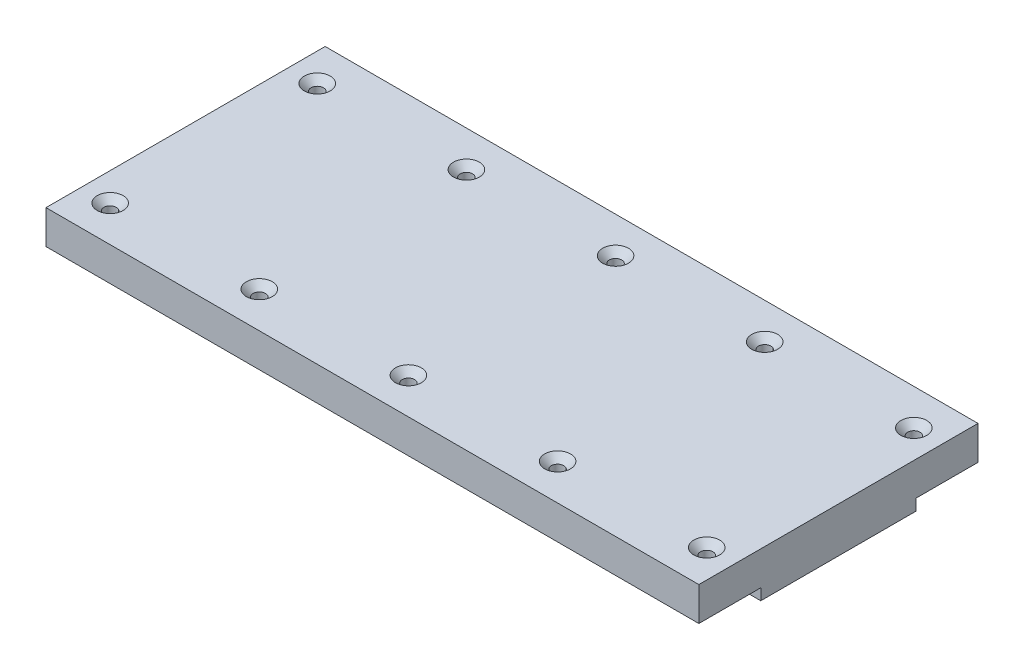
ISO-10303-21;
HEADER;
FILE_DESCRIPTION(('STEP AP214'),'2;1');
FILE_NAME('part.step','',(''),(''),'','','');
FILE_SCHEMA(('AUTOMOTIVE_DESIGN { 1 0 10303 214 1 1 1 1 }'));
ENDSEC;
DATA;
#1=APPLICATION_CONTEXT('core data for automotive mechanical design processes');
#2=APPLICATION_PROTOCOL_DEFINITION('international standard','automotive_design',2000,#1);
#3=PRODUCT_CONTEXT('',#1,'mechanical');
#4=PRODUCT('Part','Part','',(#3));
#5=PRODUCT_RELATED_PRODUCT_CATEGORY('part','',(#4));
#6=PRODUCT_DEFINITION_FORMATION('','',#4);
#7=PRODUCT_DEFINITION_CONTEXT('part definition',#1,'design');
#8=PRODUCT_DEFINITION('design','',#6,#7);
#9=PRODUCT_DEFINITION_SHAPE('','',#8);
#10=(LENGTH_UNIT() NAMED_UNIT(*) SI_UNIT(.MILLI.,.METRE.));
#11=(NAMED_UNIT(*) PLANE_ANGLE_UNIT() SI_UNIT($,.RADIAN.));
#12=(NAMED_UNIT(*) SI_UNIT($,.STERADIAN.) SOLID_ANGLE_UNIT());
#13=UNCERTAINTY_MEASURE_WITH_UNIT(LENGTH_MEASURE(1.E-05),#10,'distance_accuracy_value','');
#14=(GEOMETRIC_REPRESENTATION_CONTEXT(3) GLOBAL_UNCERTAINTY_ASSIGNED_CONTEXT((#13)) GLOBAL_UNIT_ASSIGNED_CONTEXT((#10,
#11,#12)) REPRESENTATION_CONTEXT('',''));
#15=CARTESIAN_POINT('',(0.,0.,0.));
#16=DIRECTION('',(0.,0.,1.));
#17=DIRECTION('',(1.,0.,0.));
#18=AXIS2_PLACEMENT_3D('',#15,#16,#17);
#19=CARTESIAN_POINT('',(290.,10.,69.));
#20=DIRECTION('',(-1.,0.,0.));
#21=DIRECTION('',(0.,0.,1.));
#22=AXIS2_PLACEMENT_3D('',#19,#20,#21);
#23=PLANE('',#22);
#24=DIRECTION('',(0.,0.,-1.));
#25=VECTOR('',#24,1.);
#26=CARTESIAN_POINT('',(290.,0.,69.));
#27=LINE('',#26,#25);
#28=CARTESIAN_POINT('',(290.,0.,69.));
#29=VERTEX_POINT('',#28);
#30=CARTESIAN_POINT('',(290.,0.,-69.));
#31=VERTEX_POINT('',#30);
#32=EDGE_CURVE('E135',#29,#31,#27,.T.);
#33=ORIENTED_EDGE('',*,*,#32,.T.);
#34=DIRECTION('',(0.,-1.,0.));
#35=VECTOR('',#34,1.);
#36=CARTESIAN_POINT('',(290.,10.,-69.));
#37=LINE('',#36,#35);
#38=CARTESIAN_POINT('',(290.,10.,-69.));
#39=VERTEX_POINT('',#38);
#40=EDGE_CURVE('E11',#39,#31,#37,.T.);
#41=ORIENTED_EDGE('',*,*,#40,.F.);
#42=DIRECTION('',(0.,0.,-1.));
#43=VECTOR('',#42,1.);
#44=CARTESIAN_POINT('',(290.,10.,-124.));
#45=LINE('',#44,#43);
#46=CARTESIAN_POINT('',(290.,10.,-124.));
#47=VERTEX_POINT('',#46);
#48=EDGE_CURVE('E133',#39,#47,#45,.T.);
#49=ORIENTED_EDGE('',*,*,#48,.T.);
#50=DIRECTION('',(0.,-1.,0.));
#51=VECTOR('',#50,1.);
#52=CARTESIAN_POINT('',(290.,40.,-124.));
#53=LINE('',#52,#51);
#54=CARTESIAN_POINT('',(290.,40.,-124.));
#55=VERTEX_POINT('',#54);
#56=EDGE_CURVE('E114',#55,#47,#53,.T.);
#57=ORIENTED_EDGE('',*,*,#56,.F.);
#58=DIRECTION('',(0.,0.,-1.));
#59=VECTOR('',#58,1.);
#60=CARTESIAN_POINT('',(290.,40.,-124.));
#61=LINE('',#60,#59);
#62=CARTESIAN_POINT('',(290.,40.,124.));
#63=VERTEX_POINT('',#62);
#64=EDGE_CURVE('E120',#63,#55,#61,.T.);
#65=ORIENTED_EDGE('',*,*,#64,.F.);
#66=DIRECTION('',(0.,-1.,0.));
#67=VECTOR('',#66,1.);
#68=CARTESIAN_POINT('',(290.,40.,124.));
#69=LINE('',#68,#67);
#70=CARTESIAN_POINT('',(290.,10.,124.));
#71=VERTEX_POINT('',#70);
#72=EDGE_CURVE('E241',#63,#71,#69,.T.);
#73=ORIENTED_EDGE('',*,*,#72,.T.);
#74=CARTESIAN_POINT('',(290.,10.,69.));
#75=VERTEX_POINT('',#74);
#76=EDGE_CURVE('E242',#71,#75,#45,.T.);
#77=ORIENTED_EDGE('',*,*,#76,.T.);
#78=DIRECTION('',(0.,-1.,0.));
#79=VECTOR('',#78,1.);
#80=CARTESIAN_POINT('',(290.,10.,69.));
#81=LINE('',#80,#79);
#82=EDGE_CURVE('E146',#75,#29,#81,.T.);
#83=ORIENTED_EDGE('',*,*,#82,.T.);
#84=EDGE_LOOP('',(#33,#41,#49,#57,#65,#73,#77,#83));
#85=FACE_BOUND('',#84,.T.);
#86=ADVANCED_FACE('F37',(#85),#23,.F.);
#87=CARTESIAN_POINT('',(-290.,10.,-69.));
#88=DIRECTION('',(0.,0.,1.));
#89=DIRECTION('',(1.,0.,0.));
#90=AXIS2_PLACEMENT_3D('',#87,#88,#89);
#91=PLANE('',#90);
#92=DIRECTION('',(-1.,0.,0.));
#93=VECTOR('',#92,1.);
#94=CARTESIAN_POINT('',(-290.,0.,-69.));
#95=LINE('',#94,#93);
#96=CARTESIAN_POINT('',(-290.,0.,-69.));
#97=VERTEX_POINT('',#96);
#98=EDGE_CURVE('E137',#31,#97,#95,.T.);
#99=ORIENTED_EDGE('',*,*,#98,.T.);
#100=DIRECTION('',(0.,-1.,0.));
#101=VECTOR('',#100,1.);
#102=CARTESIAN_POINT('',(-290.,10.,-69.));
#103=LINE('',#102,#101);
#104=CARTESIAN_POINT('',(-290.,10.,-69.));
#105=VERTEX_POINT('',#104);
#106=EDGE_CURVE('E46',#105,#97,#103,.T.);
#107=ORIENTED_EDGE('',*,*,#106,.F.);
#108=DIRECTION('',(-1.,0.,0.));
#109=VECTOR('',#108,1.);
#110=CARTESIAN_POINT('',(-290.,10.,-69.));
#111=LINE('',#110,#109);
#112=EDGE_CURVE('E81',#39,#105,#111,.T.);
#113=ORIENTED_EDGE('',*,*,#112,.F.);
#114=ORIENTED_EDGE('',*,*,#40,.T.);
#115=EDGE_LOOP('',(#99,#107,#113,#114));
#116=FACE_BOUND('',#115,.T.);
#117=ADVANCED_FACE('F264',(#116),#91,.F.);
#118=CARTESIAN_POINT('',(-290.,10.,69.));
#119=DIRECTION('',(1.,0.,0.));
#120=DIRECTION('',(0.,0.,-1.));
#121=AXIS2_PLACEMENT_3D('',#118,#119,#120);
#122=PLANE('',#121);
#123=DIRECTION('',(0.,0.,1.));
#124=VECTOR('',#123,1.);
#125=CARTESIAN_POINT('',(-290.,0.,69.));
#126=LINE('',#125,#124);
#127=CARTESIAN_POINT('',(-290.,0.,69.));
#128=VERTEX_POINT('',#127);
#129=EDGE_CURVE('E71',#97,#128,#126,.T.);
#130=ORIENTED_EDGE('',*,*,#129,.T.);
#131=DIRECTION('',(0.,-1.,0.));
#132=VECTOR('',#131,1.);
#133=CARTESIAN_POINT('',(-290.,10.,69.));
#134=LINE('',#133,#132);
#135=CARTESIAN_POINT('',(-290.,10.,69.));
#136=VERTEX_POINT('',#135);
#137=EDGE_CURVE('E55',#136,#128,#134,.T.);
#138=ORIENTED_EDGE('',*,*,#137,.F.);
#139=DIRECTION('',(0.,0.,1.));
#140=VECTOR('',#139,1.);
#141=CARTESIAN_POINT('',(-290.,10.,-124.));
#142=LINE('',#141,#140);
#143=CARTESIAN_POINT('',(-290.,10.,124.));
#144=VERTEX_POINT('',#143);
#145=EDGE_CURVE('E247',#136,#144,#142,.T.);
#146=ORIENTED_EDGE('',*,*,#145,.T.);
#147=DIRECTION('',(0.,-1.,0.));
#148=VECTOR('',#147,1.);
#149=CARTESIAN_POINT('',(-290.,40.,124.));
#150=LINE('',#149,#148);
#151=CARTESIAN_POINT('',(-290.,40.,124.));
#152=VERTEX_POINT('',#151);
#153=EDGE_CURVE('E139',#152,#144,#150,.T.);
#154=ORIENTED_EDGE('',*,*,#153,.F.);
#155=DIRECTION('',(0.,0.,1.));
#156=VECTOR('',#155,1.);
#157=CARTESIAN_POINT('',(-290.,40.,-124.));
#158=LINE('',#157,#156);
#159=CARTESIAN_POINT('',(-290.,40.,-124.));
#160=VERTEX_POINT('',#159);
#161=EDGE_CURVE('E119',#160,#152,#158,.T.);
#162=ORIENTED_EDGE('',*,*,#161,.F.);
#163=DIRECTION('',(0.,-1.,0.));
#164=VECTOR('',#163,1.);
#165=CARTESIAN_POINT('',(-290.,40.,-124.));
#166=LINE('',#165,#164);
#167=CARTESIAN_POINT('',(-290.,10.,-124.));
#168=VERTEX_POINT('',#167);
#169=EDGE_CURVE('E116',#160,#168,#166,.T.);
#170=ORIENTED_EDGE('',*,*,#169,.T.);
#171=EDGE_CURVE('E248',#168,#105,#142,.T.);
#172=ORIENTED_EDGE('',*,*,#171,.T.);
#173=ORIENTED_EDGE('',*,*,#106,.T.);
#174=EDGE_LOOP('',(#130,#138,#146,#154,#162,#170,#172,#173));
#175=FACE_BOUND('',#174,.T.);
#176=ADVANCED_FACE('F268',(#175),#122,.F.);
#177=CARTESIAN_POINT('',(-290.,10.,69.));
#178=DIRECTION('',(0.,0.,-1.));
#179=DIRECTION('',(-1.,0.,0.));
#180=AXIS2_PLACEMENT_3D('',#177,#178,#179);
#181=PLANE('',#180);
#182=DIRECTION('',(1.,0.,0.));
#183=VECTOR('',#182,1.);
#184=CARTESIAN_POINT('',(-290.,0.,69.));
#185=LINE('',#184,#183);
#186=EDGE_CURVE('E76',#128,#29,#185,.T.);
#187=ORIENTED_EDGE('',*,*,#186,.T.);
#188=ORIENTED_EDGE('',*,*,#82,.F.);
#189=DIRECTION('',(1.,0.,0.));
#190=VECTOR('',#189,1.);
#191=CARTESIAN_POINT('',(-290.,10.,69.));
#192=LINE('',#191,#190);
#193=EDGE_CURVE('E144',#136,#75,#192,.T.);
#194=ORIENTED_EDGE('',*,*,#193,.F.);
#195=ORIENTED_EDGE('',*,*,#137,.T.);
#196=EDGE_LOOP('',(#187,#188,#194,#195));
#197=FACE_BOUND('',#196,.T.);
#198=ADVANCED_FACE('F270',(#197),#181,.F.);
#199=CARTESIAN_POINT('',(0.,0.,0.));
#200=DIRECTION('',(0.,-1.,0.));
#201=DIRECTION('',(0.,0.,-1.));
#202=AXIS2_PLACEMENT_3D('',#199,#200,#201);
#203=PLANE('',#202);
#204=ORIENTED_EDGE('',*,*,#32,.F.);
#205=ORIENTED_EDGE('',*,*,#186,.F.);
#206=ORIENTED_EDGE('',*,*,#129,.F.);
#207=ORIENTED_EDGE('',*,*,#98,.F.);
#208=EDGE_LOOP('',(#204,#205,#206,#207));
#209=FACE_BOUND('',#208,.T.);
#210=ADVANCED_FACE('F263',(#209),#203,.T.);
#211=CARTESIAN_POINT('',(0.,10.,0.));
#212=DIRECTION('',(0.,1.,0.));
#213=DIRECTION('',(0.,0.,1.));
#214=AXIS2_PLACEMENT_3D('',#211,#212,#213);
#215=PLANE('',#214);
#216=CARTESIAN_POINT('',(-265.,10.,-92.));
#217=DIRECTION('',(0.,1.,0.));
#218=DIRECTION('',(0.,0.,1.));
#219=AXIS2_PLACEMENT_3D('',#216,#217,#218);
#220=CIRCLE('',#219,5.50000000000001);
#221=CARTESIAN_POINT('',(-265.,10.,-86.5));
#222=VERTEX_POINT('',#221);
#223=EDGE_CURVE('E40',#222,#222,#220,.T.);
#224=ORIENTED_EDGE('',*,*,#223,.T.);
#225=EDGE_LOOP('',(#224));
#226=FACE_BOUND('',#225,.T.);
#227=CARTESIAN_POINT('',(-132.5,10.,-92.));
#228=DIRECTION('',(0.,1.,0.));
#229=DIRECTION('',(0.,0.,1.));
#230=AXIS2_PLACEMENT_3D('',#227,#228,#229);
#231=CIRCLE('',#230,5.49999999999999);
#232=CARTESIAN_POINT('',(-132.5,10.,-86.5));
#233=VERTEX_POINT('',#232);
#234=EDGE_CURVE('E183',#233,#233,#231,.T.);
#235=ORIENTED_EDGE('',*,*,#234,.T.);
#236=EDGE_LOOP('',(#235));
#237=FACE_BOUND('',#236,.T.);
#238=CARTESIAN_POINT('',(0.,10.,-92.0000000000001));
#239=DIRECTION('',(0.,1.,0.));
#240=DIRECTION('',(0.,0.,1.));
#241=AXIS2_PLACEMENT_3D('',#238,#239,#240);
#242=CIRCLE('',#241,5.49999999999999);
#243=CARTESIAN_POINT('',(0.,10.,-86.5000000000001));
#244=VERTEX_POINT('',#243);
#245=EDGE_CURVE('E178',#244,#244,#242,.T.);
#246=ORIENTED_EDGE('',*,*,#245,.T.);
#247=EDGE_LOOP('',(#246));
#248=FACE_BOUND('',#247,.T.);
#249=CARTESIAN_POINT('',(265.,10.,-92.0000000000001));
#250=DIRECTION('',(0.,1.,0.));
#251=DIRECTION('',(0.,0.,1.));
#252=AXIS2_PLACEMENT_3D('',#249,#250,#251);
#253=CIRCLE('',#252,5.50000000000001);
#254=CARTESIAN_POINT('',(265.,10.,-86.5000000000001));
#255=VERTEX_POINT('',#254);
#256=EDGE_CURVE('E158',#255,#255,#253,.T.);
#257=ORIENTED_EDGE('',*,*,#256,.T.);
#258=EDGE_LOOP('',(#257));
#259=FACE_BOUND('',#258,.T.);
#260=CARTESIAN_POINT('',(132.5,10.,-92.));
#261=DIRECTION('',(0.,1.,0.));
#262=DIRECTION('',(0.,0.,1.));
#263=AXIS2_PLACEMENT_3D('',#260,#261,#262);
#264=CIRCLE('',#263,5.49999999999999);
#265=CARTESIAN_POINT('',(132.5,10.,-86.5));
#266=VERTEX_POINT('',#265);
#267=EDGE_CURVE('E154',#266,#266,#264,.T.);
#268=ORIENTED_EDGE('',*,*,#267,.T.);
#269=EDGE_LOOP('',(#268));
#270=FACE_BOUND('',#269,.T.);
#271=ORIENTED_EDGE('',*,*,#48,.F.);
#272=ORIENTED_EDGE('',*,*,#112,.T.);
#273=ORIENTED_EDGE('',*,*,#171,.F.);
#274=DIRECTION('',(-1.,0.,0.));
#275=VECTOR('',#274,1.);
#276=CARTESIAN_POINT('',(-290.,10.,-124.));
#277=LINE('',#276,#275);
#278=EDGE_CURVE('E245',#47,#168,#277,.T.);
#279=ORIENTED_EDGE('',*,*,#278,.F.);
#280=EDGE_LOOP('',(#271,#272,#273,#279));
#281=FACE_BOUND('',#280,.T.);
#282=ADVANCED_FACE('F266',(#226,#237,#248,#259,#270,#281),#215,.F.);
#283=CARTESIAN_POINT('',(-265.,10.,92.));
#284=DIRECTION('',(0.,1.,0.));
#285=DIRECTION('',(0.,0.,1.));
#286=AXIS2_PLACEMENT_3D('',#283,#284,#285);
#287=CIRCLE('',#286,5.50000000000001);
#288=CARTESIAN_POINT('',(-265.,10.,97.5));
#289=VERTEX_POINT('',#288);
#290=EDGE_CURVE('E192',#289,#289,#287,.T.);
#291=ORIENTED_EDGE('',*,*,#290,.T.);
#292=EDGE_LOOP('',(#291));
#293=FACE_BOUND('',#292,.T.);
#294=CARTESIAN_POINT('',(-132.5,10.,92.));
#295=DIRECTION('',(0.,1.,0.));
#296=DIRECTION('',(0.,0.,1.));
#297=AXIS2_PLACEMENT_3D('',#294,#295,#296);
#298=CIRCLE('',#297,5.49999999999999);
#299=CARTESIAN_POINT('',(-132.5,10.,97.5));
#300=VERTEX_POINT('',#299);
#301=EDGE_CURVE('E188',#300,#300,#298,.T.);
#302=ORIENTED_EDGE('',*,*,#301,.T.);
#303=EDGE_LOOP('',(#302));
#304=FACE_BOUND('',#303,.T.);
#305=CARTESIAN_POINT('',(0.,10.,92.));
#306=DIRECTION('',(0.,1.,0.));
#307=DIRECTION('',(0.,0.,1.));
#308=AXIS2_PLACEMENT_3D('',#305,#306,#307);
#309=CIRCLE('',#308,5.49999999999999);
#310=CARTESIAN_POINT('',(0.,10.,97.5));
#311=VERTEX_POINT('',#310);
#312=EDGE_CURVE('E173',#311,#311,#309,.T.);
#313=ORIENTED_EDGE('',*,*,#312,.T.);
#314=EDGE_LOOP('',(#313));
#315=FACE_BOUND('',#314,.T.);
#316=CARTESIAN_POINT('',(132.5,10.,92.));
#317=DIRECTION('',(0.,1.,0.));
#318=DIRECTION('',(0.,0.,1.));
#319=AXIS2_PLACEMENT_3D('',#316,#317,#318);
#320=CIRCLE('',#319,5.49999999999999);
#321=CARTESIAN_POINT('',(132.5,10.,97.5));
#322=VERTEX_POINT('',#321);
#323=EDGE_CURVE('E168',#322,#322,#320,.T.);
#324=ORIENTED_EDGE('',*,*,#323,.T.);
#325=EDGE_LOOP('',(#324));
#326=FACE_BOUND('',#325,.T.);
#327=CARTESIAN_POINT('',(265.,10.,92.));
#328=DIRECTION('',(0.,1.,0.));
#329=DIRECTION('',(0.,0.,1.));
#330=AXIS2_PLACEMENT_3D('',#327,#328,#329);
#331=CIRCLE('',#330,5.50000000000001);
#332=CARTESIAN_POINT('',(265.,10.,97.5));
#333=VERTEX_POINT('',#332);
#334=EDGE_CURVE('E163',#333,#333,#331,.T.);
#335=ORIENTED_EDGE('',*,*,#334,.T.);
#336=EDGE_LOOP('',(#335));
#337=FACE_BOUND('',#336,.T.);
#338=ORIENTED_EDGE('',*,*,#145,.F.);
#339=ORIENTED_EDGE('',*,*,#193,.T.);
#340=ORIENTED_EDGE('',*,*,#76,.F.);
#341=DIRECTION('',(1.,0.,0.));
#342=VECTOR('',#341,1.);
#343=CARTESIAN_POINT('',(-290.,10.,124.));
#344=LINE('',#343,#342);
#345=EDGE_CURVE('E129',#144,#71,#344,.T.);
#346=ORIENTED_EDGE('',*,*,#345,.F.);
#347=EDGE_LOOP('',(#338,#339,#340,#346));
#348=FACE_BOUND('',#347,.T.);
#349=ADVANCED_FACE('F260',(#293,#304,#315,#326,#337,#348),#215,.F.);
#350=CARTESIAN_POINT('',(-290.,40.,-124.));
#351=DIRECTION('',(0.,0.,1.));
#352=DIRECTION('',(1.,0.,0.));
#353=AXIS2_PLACEMENT_3D('',#350,#351,#352);
#354=PLANE('',#353);
#355=ORIENTED_EDGE('',*,*,#278,.T.);
#356=ORIENTED_EDGE('',*,*,#169,.F.);
#357=DIRECTION('',(-1.,0.,0.));
#358=VECTOR('',#357,1.);
#359=CARTESIAN_POINT('',(-290.,40.,-124.));
#360=LINE('',#359,#358);
#361=EDGE_CURVE('E110',#55,#160,#360,.T.);
#362=ORIENTED_EDGE('',*,*,#361,.F.);
#363=ORIENTED_EDGE('',*,*,#56,.T.);
#364=EDGE_LOOP('',(#355,#356,#362,#363));
#365=FACE_BOUND('',#364,.T.);
#366=ADVANCED_FACE('F112',(#365),#354,.F.);
#367=CARTESIAN_POINT('',(-290.,40.,124.));
#368=DIRECTION('',(0.,0.,-1.));
#369=DIRECTION('',(-1.,0.,0.));
#370=AXIS2_PLACEMENT_3D('',#367,#368,#369);
#371=PLANE('',#370);
#372=ORIENTED_EDGE('',*,*,#345,.T.);
#373=ORIENTED_EDGE('',*,*,#72,.F.);
#374=DIRECTION('',(1.,0.,0.));
#375=VECTOR('',#374,1.);
#376=CARTESIAN_POINT('',(-290.,40.,124.));
#377=LINE('',#376,#375);
#378=EDGE_CURVE('E125',#152,#63,#377,.T.);
#379=ORIENTED_EDGE('',*,*,#378,.F.);
#380=ORIENTED_EDGE('',*,*,#153,.T.);
#381=EDGE_LOOP('',(#372,#373,#379,#380));
#382=FACE_BOUND('',#381,.T.);
#383=ADVANCED_FACE('F256',(#382),#371,.F.);
#384=CARTESIAN_POINT('',(0.,40.,0.));
#385=DIRECTION('',(0.,1.,0.));
#386=DIRECTION('',(0.,0.,1.));
#387=AXIS2_PLACEMENT_3D('',#384,#385,#386);
#388=PLANE('',#387);
#389=CARTESIAN_POINT('',(-265.,40.,-92.));
#390=DIRECTION('',(0.,1.,0.));
#391=DIRECTION('',(0.,0.,1.));
#392=AXIS2_PLACEMENT_3D('',#389,#390,#391);
#393=CIRCLE('',#392,11.5);
#394=CARTESIAN_POINT('',(-265.,40.,-80.5));
#395=VERTEX_POINT('',#394);
#396=EDGE_CURVE('E558',#395,#395,#393,.T.);
#397=ORIENTED_EDGE('',*,*,#396,.F.);
#398=EDGE_LOOP('',(#397));
#399=FACE_BOUND('',#398,.T.);
#400=CARTESIAN_POINT('',(-265.,40.,92.));
#401=DIRECTION('',(0.,1.,0.));
#402=DIRECTION('',(0.,0.,1.));
#403=AXIS2_PLACEMENT_3D('',#400,#401,#402);
#404=CIRCLE('',#403,11.5);
#405=CARTESIAN_POINT('',(-265.,40.,103.5));
#406=VERTEX_POINT('',#405);
#407=EDGE_CURVE('E201',#406,#406,#404,.T.);
#408=ORIENTED_EDGE('',*,*,#407,.F.);
#409=EDGE_LOOP('',(#408));
#410=FACE_BOUND('',#409,.T.);
#411=CARTESIAN_POINT('',(-132.5,40.,92.));
#412=DIRECTION('',(0.,1.,0.));
#413=DIRECTION('',(0.,0.,1.));
#414=AXIS2_PLACEMENT_3D('',#411,#412,#413);
#415=CIRCLE('',#414,11.5);
#416=CARTESIAN_POINT('',(-132.5,40.,103.5));
#417=VERTEX_POINT('',#416);
#418=EDGE_CURVE('E194',#417,#417,#415,.T.);
#419=ORIENTED_EDGE('',*,*,#418,.F.);
#420=EDGE_LOOP('',(#419));
#421=FACE_BOUND('',#420,.T.);
#422=CARTESIAN_POINT('',(-132.5,40.,-92.));
#423=DIRECTION('',(0.,1.,0.));
#424=DIRECTION('',(0.,0.,1.));
#425=AXIS2_PLACEMENT_3D('',#422,#423,#424);
#426=CIRCLE('',#425,11.5);
#427=CARTESIAN_POINT('',(-132.5,40.,-80.5));
#428=VERTEX_POINT('',#427);
#429=EDGE_CURVE('E190',#428,#428,#426,.T.);
#430=ORIENTED_EDGE('',*,*,#429,.F.);
#431=EDGE_LOOP('',(#430));
#432=FACE_BOUND('',#431,.T.);
#433=CARTESIAN_POINT('',(0.,40.,-92.0000000000001));
#434=DIRECTION('',(0.,1.,0.));
#435=DIRECTION('',(0.,0.,1.));
#436=AXIS2_PLACEMENT_3D('',#433,#434,#435);
#437=CIRCLE('',#436,11.5);
#438=CARTESIAN_POINT('',(0.,40.,-80.5000000000001));
#439=VERTEX_POINT('',#438);
#440=EDGE_CURVE('E186',#439,#439,#437,.T.);
#441=ORIENTED_EDGE('',*,*,#440,.F.);
#442=EDGE_LOOP('',(#441));
#443=FACE_BOUND('',#442,.T.);
#444=CARTESIAN_POINT('',(0.,40.,92.));
#445=DIRECTION('',(0.,1.,0.));
#446=DIRECTION('',(0.,0.,1.));
#447=AXIS2_PLACEMENT_3D('',#444,#445,#446);
#448=CIRCLE('',#447,11.5);
#449=CARTESIAN_POINT('',(0.,40.,103.5));
#450=VERTEX_POINT('',#449);
#451=EDGE_CURVE('E181',#450,#450,#448,.T.);
#452=ORIENTED_EDGE('',*,*,#451,.F.);
#453=EDGE_LOOP('',(#452));
#454=FACE_BOUND('',#453,.T.);
#455=CARTESIAN_POINT('',(132.5,40.,92.));
#456=DIRECTION('',(0.,1.,0.));
#457=DIRECTION('',(0.,0.,1.));
#458=AXIS2_PLACEMENT_3D('',#455,#456,#457);
#459=CIRCLE('',#458,11.5);
#460=CARTESIAN_POINT('',(132.5,40.,103.5));
#461=VERTEX_POINT('',#460);
#462=EDGE_CURVE('E176',#461,#461,#459,.T.);
#463=ORIENTED_EDGE('',*,*,#462,.F.);
#464=EDGE_LOOP('',(#463));
#465=FACE_BOUND('',#464,.T.);
#466=CARTESIAN_POINT('',(265.,40.,92.));
#467=DIRECTION('',(0.,1.,0.));
#468=DIRECTION('',(0.,0.,1.));
#469=AXIS2_PLACEMENT_3D('',#466,#467,#468);
#470=CIRCLE('',#469,11.5);
#471=CARTESIAN_POINT('',(265.,40.,103.5));
#472=VERTEX_POINT('',#471);
#473=EDGE_CURVE('E171',#472,#472,#470,.T.);
#474=ORIENTED_EDGE('',*,*,#473,.F.);
#475=EDGE_LOOP('',(#474));
#476=FACE_BOUND('',#475,.T.);
#477=CARTESIAN_POINT('',(265.,40.,-92.0000000000001));
#478=DIRECTION('',(0.,1.,0.));
#479=DIRECTION('',(0.,0.,1.));
#480=AXIS2_PLACEMENT_3D('',#477,#478,#479);
#481=CIRCLE('',#480,11.5);
#482=CARTESIAN_POINT('',(265.,40.,-80.5000000000001));
#483=VERTEX_POINT('',#482);
#484=EDGE_CURVE('E166',#483,#483,#481,.T.);
#485=ORIENTED_EDGE('',*,*,#484,.F.);
#486=EDGE_LOOP('',(#485));
#487=FACE_BOUND('',#486,.T.);
#488=CARTESIAN_POINT('',(132.5,40.,-92.));
#489=DIRECTION('',(0.,1.,0.));
#490=DIRECTION('',(0.,0.,1.));
#491=AXIS2_PLACEMENT_3D('',#488,#489,#490);
#492=CIRCLE('',#491,11.5);
#493=CARTESIAN_POINT('',(132.5,40.,-80.5));
#494=VERTEX_POINT('',#493);
#495=EDGE_CURVE('E161',#494,#494,#492,.T.);
#496=ORIENTED_EDGE('',*,*,#495,.F.);
#497=EDGE_LOOP('',(#496));
#498=FACE_BOUND('',#497,.T.);
#499=ORIENTED_EDGE('',*,*,#64,.T.);
#500=ORIENTED_EDGE('',*,*,#361,.T.);
#501=ORIENTED_EDGE('',*,*,#161,.T.);
#502=ORIENTED_EDGE('',*,*,#378,.T.);
#503=EDGE_LOOP('',(#499,#500,#501,#502));
#504=FACE_BOUND('',#503,.T.);
#505=ADVANCED_FACE('F123',(#399,#410,#421,#432,#443,#454,#465,#476,#487,#498,#504),#388,.T.);
#506=CARTESIAN_POINT('',(132.5,40.,-92.));
#507=DIRECTION('',(0.,1.,0.));
#508=DIRECTION('',(0.,0.,1.));
#509=AXIS2_PLACEMENT_3D('',#506,#507,#508);
#510=CYLINDRICAL_SURFACE('',#509,5.49999999999999);
#511=CARTESIAN_POINT('',(132.5,34.,-92.));
#512=DIRECTION('',(0.,1.,0.));
#513=DIRECTION('',(0.,0.,1.));
#514=AXIS2_PLACEMENT_3D('',#511,#512,#513);
#515=CIRCLE('',#514,5.50000000000001);
#516=CARTESIAN_POINT('',(132.5,34.,-86.5));
#517=VERTEX_POINT('',#516);
#518=EDGE_CURVE('E157',#517,#517,#515,.T.);
#519=ORIENTED_EDGE('',*,*,#518,.T.);
#520=EDGE_LOOP('',(#519));
#521=FACE_BOUND('',#520,.T.);
#522=ORIENTED_EDGE('',*,*,#267,.F.);
#523=EDGE_LOOP('',(#522));
#524=FACE_BOUND('',#523,.T.);
#525=ADVANCED_FACE('F340',(#521,#524),#510,.F.);
#526=CARTESIAN_POINT('',(132.5,40.,-92.));
#527=DIRECTION('',(0.,1.,0.));
#528=DIRECTION('',(0.,0.,1.));
#529=AXIS2_PLACEMENT_3D('',#526,#527,#528);
#530=CONICAL_SURFACE('',#529,11.5,0.785398163397449);
#531=ORIENTED_EDGE('',*,*,#518,.F.);
#532=EDGE_LOOP('',(#531));
#533=FACE_BOUND('',#532,.T.);
#534=ORIENTED_EDGE('',*,*,#495,.T.);
#535=EDGE_LOOP('',(#534));
#536=FACE_BOUND('',#535,.T.);
#537=ADVANCED_FACE('F350',(#533,#536),#530,.F.);
#538=CARTESIAN_POINT('',(265.,40.,-92.0000000000001));
#539=DIRECTION('',(0.,1.,0.));
#540=DIRECTION('',(0.,0.,1.));
#541=AXIS2_PLACEMENT_3D('',#538,#539,#540);
#542=CYLINDRICAL_SURFACE('',#541,5.50000000000001);
#543=CARTESIAN_POINT('',(265.,34.,-92.0000000000001));
#544=DIRECTION('',(0.,1.,0.));
#545=DIRECTION('',(0.,0.,1.));
#546=AXIS2_PLACEMENT_3D('',#543,#544,#545);
#547=CIRCLE('',#546,5.50000000000001);
#548=CARTESIAN_POINT('',(265.,34.,-86.5000000000001));
#549=VERTEX_POINT('',#548);
#550=EDGE_CURVE('E162',#549,#549,#547,.T.);
#551=ORIENTED_EDGE('',*,*,#550,.T.);
#552=EDGE_LOOP('',(#551));
#553=FACE_BOUND('',#552,.T.);
#554=ORIENTED_EDGE('',*,*,#256,.F.);
#555=EDGE_LOOP('',(#554));
#556=FACE_BOUND('',#555,.T.);
#557=ADVANCED_FACE('F360',(#553,#556),#542,.F.);
#558=CARTESIAN_POINT('',(265.,40.,-92.0000000000001));
#559=DIRECTION('',(0.,1.,0.));
#560=DIRECTION('',(0.,0.,1.));
#561=AXIS2_PLACEMENT_3D('',#558,#559,#560);
#562=CONICAL_SURFACE('',#561,11.5,0.785398163397449);
#563=ORIENTED_EDGE('',*,*,#550,.F.);
#564=EDGE_LOOP('',(#563));
#565=FACE_BOUND('',#564,.T.);
#566=ORIENTED_EDGE('',*,*,#484,.T.);
#567=EDGE_LOOP('',(#566));
#568=FACE_BOUND('',#567,.T.);
#569=ADVANCED_FACE('F370',(#565,#568),#562,.F.);
#570=CARTESIAN_POINT('',(265.,40.,92.));
#571=DIRECTION('',(0.,1.,0.));
#572=DIRECTION('',(0.,0.,1.));
#573=AXIS2_PLACEMENT_3D('',#570,#571,#572);
#574=CYLINDRICAL_SURFACE('',#573,5.50000000000001);
#575=CARTESIAN_POINT('',(265.,34.,92.));
#576=DIRECTION('',(0.,1.,0.));
#577=DIRECTION('',(0.,0.,1.));
#578=AXIS2_PLACEMENT_3D('',#575,#576,#577);
#579=CIRCLE('',#578,5.50000000000001);
#580=CARTESIAN_POINT('',(265.,34.,97.5));
#581=VERTEX_POINT('',#580);
#582=EDGE_CURVE('E167',#581,#581,#579,.T.);
#583=ORIENTED_EDGE('',*,*,#582,.T.);
#584=EDGE_LOOP('',(#583));
#585=FACE_BOUND('',#584,.T.);
#586=ORIENTED_EDGE('',*,*,#334,.F.);
#587=EDGE_LOOP('',(#586));
#588=FACE_BOUND('',#587,.T.);
#589=ADVANCED_FACE('F380',(#585,#588),#574,.F.);
#590=CARTESIAN_POINT('',(265.,40.,92.));
#591=DIRECTION('',(0.,1.,0.));
#592=DIRECTION('',(0.,0.,1.));
#593=AXIS2_PLACEMENT_3D('',#590,#591,#592);
#594=CONICAL_SURFACE('',#593,11.5,0.785398163397449);
#595=ORIENTED_EDGE('',*,*,#582,.F.);
#596=EDGE_LOOP('',(#595));
#597=FACE_BOUND('',#596,.T.);
#598=ORIENTED_EDGE('',*,*,#473,.T.);
#599=EDGE_LOOP('',(#598));
#600=FACE_BOUND('',#599,.T.);
#601=ADVANCED_FACE('F390',(#597,#600),#594,.F.);
#602=CARTESIAN_POINT('',(132.5,40.,92.));
#603=DIRECTION('',(0.,1.,0.));
#604=DIRECTION('',(0.,0.,1.));
#605=AXIS2_PLACEMENT_3D('',#602,#603,#604);
#606=CYLINDRICAL_SURFACE('',#605,5.49999999999999);
#607=CARTESIAN_POINT('',(132.5,34.,92.));
#608=DIRECTION('',(0.,1.,0.));
#609=DIRECTION('',(0.,0.,1.));
#610=AXIS2_PLACEMENT_3D('',#607,#608,#609);
#611=CIRCLE('',#610,5.50000000000001);
#612=CARTESIAN_POINT('',(132.5,34.,97.5));
#613=VERTEX_POINT('',#612);
#614=EDGE_CURVE('E172',#613,#613,#611,.T.);
#615=ORIENTED_EDGE('',*,*,#614,.T.);
#616=EDGE_LOOP('',(#615));
#617=FACE_BOUND('',#616,.T.);
#618=ORIENTED_EDGE('',*,*,#323,.F.);
#619=EDGE_LOOP('',(#618));
#620=FACE_BOUND('',#619,.T.);
#621=ADVANCED_FACE('F400',(#617,#620),#606,.F.);
#622=CARTESIAN_POINT('',(132.5,40.,92.));
#623=DIRECTION('',(0.,1.,0.));
#624=DIRECTION('',(0.,0.,1.));
#625=AXIS2_PLACEMENT_3D('',#622,#623,#624);
#626=CONICAL_SURFACE('',#625,11.5,0.785398163397449);
#627=ORIENTED_EDGE('',*,*,#614,.F.);
#628=EDGE_LOOP('',(#627));
#629=FACE_BOUND('',#628,.T.);
#630=ORIENTED_EDGE('',*,*,#462,.T.);
#631=EDGE_LOOP('',(#630));
#632=FACE_BOUND('',#631,.T.);
#633=ADVANCED_FACE('F410',(#629,#632),#626,.F.);
#634=CARTESIAN_POINT('',(0.,40.,92.));
#635=DIRECTION('',(0.,1.,0.));
#636=DIRECTION('',(0.,0.,1.));
#637=AXIS2_PLACEMENT_3D('',#634,#635,#636);
#638=CYLINDRICAL_SURFACE('',#637,5.49999999999999);
#639=CARTESIAN_POINT('',(0.,34.,92.));
#640=DIRECTION('',(0.,1.,0.));
#641=DIRECTION('',(0.,0.,1.));
#642=AXIS2_PLACEMENT_3D('',#639,#640,#641);
#643=CIRCLE('',#642,5.49999999999999);
#644=CARTESIAN_POINT('',(0.,34.,97.5));
#645=VERTEX_POINT('',#644);
#646=EDGE_CURVE('E177',#645,#645,#643,.T.);
#647=ORIENTED_EDGE('',*,*,#646,.T.);
#648=EDGE_LOOP('',(#647));
#649=FACE_BOUND('',#648,.T.);
#650=ORIENTED_EDGE('',*,*,#312,.F.);
#651=EDGE_LOOP('',(#650));
#652=FACE_BOUND('',#651,.T.);
#653=ADVANCED_FACE('F420',(#649,#652),#638,.F.);
#654=CARTESIAN_POINT('',(0.,40.,92.));
#655=DIRECTION('',(0.,1.,0.));
#656=DIRECTION('',(0.,0.,1.));
#657=AXIS2_PLACEMENT_3D('',#654,#655,#656);
#658=CONICAL_SURFACE('',#657,11.5,0.785398163397449);
#659=ORIENTED_EDGE('',*,*,#646,.F.);
#660=EDGE_LOOP('',(#659));
#661=FACE_BOUND('',#660,.T.);
#662=ORIENTED_EDGE('',*,*,#451,.T.);
#663=EDGE_LOOP('',(#662));
#664=FACE_BOUND('',#663,.T.);
#665=ADVANCED_FACE('F430',(#661,#664),#658,.F.);
#666=CARTESIAN_POINT('',(0.,40.,-92.0000000000001));
#667=DIRECTION('',(0.,1.,0.));
#668=DIRECTION('',(0.,0.,1.));
#669=AXIS2_PLACEMENT_3D('',#666,#667,#668);
#670=CYLINDRICAL_SURFACE('',#669,5.49999999999999);
#671=CARTESIAN_POINT('',(0.,34.,-92.0000000000001));
#672=DIRECTION('',(0.,1.,0.));
#673=DIRECTION('',(0.,0.,1.));
#674=AXIS2_PLACEMENT_3D('',#671,#672,#673);
#675=CIRCLE('',#674,5.49999999999999);
#676=CARTESIAN_POINT('',(0.,34.,-86.5000000000001));
#677=VERTEX_POINT('',#676);
#678=EDGE_CURVE('E182',#677,#677,#675,.T.);
#679=ORIENTED_EDGE('',*,*,#678,.T.);
#680=EDGE_LOOP('',(#679));
#681=FACE_BOUND('',#680,.T.);
#682=ORIENTED_EDGE('',*,*,#245,.F.);
#683=EDGE_LOOP('',(#682));
#684=FACE_BOUND('',#683,.T.);
#685=ADVANCED_FACE('F440',(#681,#684),#670,.F.);
#686=CARTESIAN_POINT('',(0.,40.,-92.0000000000001));
#687=DIRECTION('',(0.,1.,0.));
#688=DIRECTION('',(0.,0.,1.));
#689=AXIS2_PLACEMENT_3D('',#686,#687,#688);
#690=CONICAL_SURFACE('',#689,11.5,0.785398163397449);
#691=ORIENTED_EDGE('',*,*,#678,.F.);
#692=EDGE_LOOP('',(#691));
#693=FACE_BOUND('',#692,.T.);
#694=ORIENTED_EDGE('',*,*,#440,.T.);
#695=EDGE_LOOP('',(#694));
#696=FACE_BOUND('',#695,.T.);
#697=ADVANCED_FACE('F450',(#693,#696),#690,.F.);
#698=CARTESIAN_POINT('',(-132.5,40.,-92.));
#699=DIRECTION('',(0.,1.,0.));
#700=DIRECTION('',(0.,0.,1.));
#701=AXIS2_PLACEMENT_3D('',#698,#699,#700);
#702=CYLINDRICAL_SURFACE('',#701,5.49999999999999);
#703=CARTESIAN_POINT('',(-132.5,34.,-92.));
#704=DIRECTION('',(0.,1.,0.));
#705=DIRECTION('',(0.,0.,1.));
#706=AXIS2_PLACEMENT_3D('',#703,#704,#705);
#707=CIRCLE('',#706,5.50000000000001);
#708=CARTESIAN_POINT('',(-132.5,34.,-86.5));
#709=VERTEX_POINT('',#708);
#710=EDGE_CURVE('E187',#709,#709,#707,.T.);
#711=ORIENTED_EDGE('',*,*,#710,.T.);
#712=EDGE_LOOP('',(#711));
#713=FACE_BOUND('',#712,.T.);
#714=ORIENTED_EDGE('',*,*,#234,.F.);
#715=EDGE_LOOP('',(#714));
#716=FACE_BOUND('',#715,.T.);
#717=ADVANCED_FACE('F460',(#713,#716),#702,.F.);
#718=CARTESIAN_POINT('',(-132.5,40.,-92.));
#719=DIRECTION('',(0.,1.,0.));
#720=DIRECTION('',(0.,0.,1.));
#721=AXIS2_PLACEMENT_3D('',#718,#719,#720);
#722=CONICAL_SURFACE('',#721,11.5,0.785398163397448);
#723=ORIENTED_EDGE('',*,*,#710,.F.);
#724=EDGE_LOOP('',(#723));
#725=FACE_BOUND('',#724,.T.);
#726=ORIENTED_EDGE('',*,*,#429,.T.);
#727=EDGE_LOOP('',(#726));
#728=FACE_BOUND('',#727,.T.);
#729=ADVANCED_FACE('F470',(#725,#728),#722,.F.);
#730=CARTESIAN_POINT('',(-132.5,40.,92.));
#731=DIRECTION('',(0.,1.,0.));
#732=DIRECTION('',(0.,0.,1.));
#733=AXIS2_PLACEMENT_3D('',#730,#731,#732);
#734=CYLINDRICAL_SURFACE('',#733,5.49999999999999);
#735=CARTESIAN_POINT('',(-132.5,34.,92.));
#736=DIRECTION('',(0.,1.,0.));
#737=DIRECTION('',(0.,0.,1.));
#738=AXIS2_PLACEMENT_3D('',#735,#736,#737);
#739=CIRCLE('',#738,5.50000000000001);
#740=CARTESIAN_POINT('',(-132.5,34.,97.5));
#741=VERTEX_POINT('',#740);
#742=EDGE_CURVE('E191',#741,#741,#739,.T.);
#743=ORIENTED_EDGE('',*,*,#742,.T.);
#744=EDGE_LOOP('',(#743));
#745=FACE_BOUND('',#744,.T.);
#746=ORIENTED_EDGE('',*,*,#301,.F.);
#747=EDGE_LOOP('',(#746));
#748=FACE_BOUND('',#747,.T.);
#749=ADVANCED_FACE('F480',(#745,#748),#734,.F.);
#750=CARTESIAN_POINT('',(-132.5,40.,92.));
#751=DIRECTION('',(0.,1.,0.));
#752=DIRECTION('',(0.,0.,1.));
#753=AXIS2_PLACEMENT_3D('',#750,#751,#752);
#754=CONICAL_SURFACE('',#753,11.5,0.785398163397448);
#755=ORIENTED_EDGE('',*,*,#742,.F.);
#756=EDGE_LOOP('',(#755));
#757=FACE_BOUND('',#756,.T.);
#758=ORIENTED_EDGE('',*,*,#418,.T.);
#759=EDGE_LOOP('',(#758));
#760=FACE_BOUND('',#759,.T.);
#761=ADVANCED_FACE('F490',(#757,#760),#754,.F.);
#762=CARTESIAN_POINT('',(-265.,40.,92.));
#763=DIRECTION('',(0.,1.,0.));
#764=DIRECTION('',(0.,0.,1.));
#765=AXIS2_PLACEMENT_3D('',#762,#763,#764);
#766=CYLINDRICAL_SURFACE('',#765,5.50000000000001);
#767=CARTESIAN_POINT('',(-265.,34.,92.));
#768=DIRECTION('',(0.,1.,0.));
#769=DIRECTION('',(0.,0.,1.));
#770=AXIS2_PLACEMENT_3D('',#767,#768,#769);
#771=CIRCLE('',#770,5.50000000000001);
#772=CARTESIAN_POINT('',(-265.,34.,97.5));
#773=VERTEX_POINT('',#772);
#774=EDGE_CURVE('E195',#773,#773,#771,.T.);
#775=ORIENTED_EDGE('',*,*,#774,.T.);
#776=EDGE_LOOP('',(#775));
#777=FACE_BOUND('',#776,.T.);
#778=ORIENTED_EDGE('',*,*,#290,.F.);
#779=EDGE_LOOP('',(#778));
#780=FACE_BOUND('',#779,.T.);
#781=ADVANCED_FACE('F500',(#777,#780),#766,.F.);
#782=CARTESIAN_POINT('',(-265.,40.,92.));
#783=DIRECTION('',(0.,1.,0.));
#784=DIRECTION('',(0.,0.,1.));
#785=AXIS2_PLACEMENT_3D('',#782,#783,#784);
#786=CONICAL_SURFACE('',#785,11.5,0.785398163397449);
#787=ORIENTED_EDGE('',*,*,#774,.F.);
#788=EDGE_LOOP('',(#787));
#789=FACE_BOUND('',#788,.T.);
#790=ORIENTED_EDGE('',*,*,#407,.T.);
#791=EDGE_LOOP('',(#790));
#792=FACE_BOUND('',#791,.T.);
#793=ADVANCED_FACE('F510',(#789,#792),#786,.F.);
#794=CARTESIAN_POINT('',(-265.,40.,-92.));
#795=DIRECTION('',(0.,1.,0.));
#796=DIRECTION('',(0.,0.,1.));
#797=AXIS2_PLACEMENT_3D('',#794,#795,#796);
#798=CYLINDRICAL_SURFACE('',#797,5.50000000000001);
#799=CARTESIAN_POINT('',(-265.,34.,-92.));
#800=DIRECTION('',(0.,1.,0.));
#801=DIRECTION('',(0.,0.,1.));
#802=AXIS2_PLACEMENT_3D('',#799,#800,#801);
#803=CIRCLE('',#802,5.50000000000001);
#804=CARTESIAN_POINT('',(-265.,34.,-86.5));
#805=VERTEX_POINT('',#804);
#806=EDGE_CURVE('E555',#805,#805,#803,.T.);
#807=ORIENTED_EDGE('',*,*,#806,.T.);
#808=EDGE_LOOP('',(#807));
#809=FACE_BOUND('',#808,.T.);
#810=ORIENTED_EDGE('',*,*,#223,.F.);
#811=EDGE_LOOP('',(#810));
#812=FACE_BOUND('',#811,.T.);
#813=ADVANCED_FACE('F519',(#809,#812),#798,.F.);
#814=CARTESIAN_POINT('',(-265.,40.,-92.));
#815=DIRECTION('',(0.,1.,0.));
#816=DIRECTION('',(0.,0.,1.));
#817=AXIS2_PLACEMENT_3D('',#814,#815,#816);
#818=CONICAL_SURFACE('',#817,11.5,0.785398163397449);
#819=ORIENTED_EDGE('',*,*,#806,.F.);
#820=EDGE_LOOP('',(#819));
#821=FACE_BOUND('',#820,.T.);
#822=ORIENTED_EDGE('',*,*,#396,.T.);
#823=EDGE_LOOP('',(#822));
#824=FACE_BOUND('',#823,.T.);
#825=ADVANCED_FACE('F529',(#821,#824),#818,.F.);
#826=CLOSED_SHELL('',(#86,#117,#176,#198,#210,#282,#349,#366,#383,#505,#525,#537,#557,#569,#589,
#601,#621,#633,#653,#665,#685,#697,#717,#729,#749,#761,#781,#793,#813,#825));
#827=MANIFOLD_SOLID_BREP('B2',#826);
#828=ADVANCED_BREP_SHAPE_REPRESENTATION('',(#18,#827),#14);
#829=SHAPE_DEFINITION_REPRESENTATION(#9,#828);
ENDSEC;
END-ISO-10303-21;
